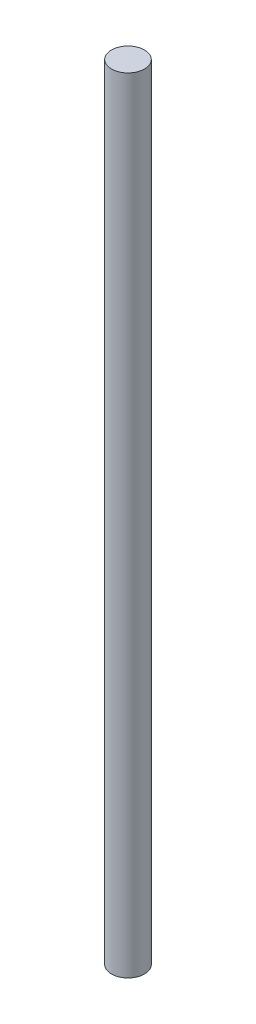
ISO-10303-21;
HEADER;
FILE_DESCRIPTION(('STEP AP214'),'2;1');
FILE_NAME('part.step','',(''),(''),'','','');
FILE_SCHEMA(('AUTOMOTIVE_DESIGN { 1 0 10303 214 1 1 1 1 }'));
ENDSEC;
DATA;
#1=APPLICATION_CONTEXT('core data for automotive mechanical design processes');
#2=APPLICATION_PROTOCOL_DEFINITION('international standard','automotive_design',2000,#1);
#3=PRODUCT_CONTEXT('',#1,'mechanical');
#4=PRODUCT('Part','Part','',(#3));
#5=PRODUCT_RELATED_PRODUCT_CATEGORY('part','',(#4));
#6=PRODUCT_DEFINITION_FORMATION('','',#4);
#7=PRODUCT_DEFINITION_CONTEXT('part definition',#1,'design');
#8=PRODUCT_DEFINITION('design','',#6,#7);
#9=PRODUCT_DEFINITION_SHAPE('','',#8);
#10=(LENGTH_UNIT() NAMED_UNIT(*) SI_UNIT(.MILLI.,.METRE.));
#11=(NAMED_UNIT(*) PLANE_ANGLE_UNIT() SI_UNIT($,.RADIAN.));
#12=(NAMED_UNIT(*) SI_UNIT($,.STERADIAN.) SOLID_ANGLE_UNIT());
#13=UNCERTAINTY_MEASURE_WITH_UNIT(LENGTH_MEASURE(1.E-05),#10,'distance_accuracy_value','');
#14=(GEOMETRIC_REPRESENTATION_CONTEXT(3) GLOBAL_UNCERTAINTY_ASSIGNED_CONTEXT((#13)) GLOBAL_UNIT_ASSIGNED_CONTEXT((#10,
#11,#12)) REPRESENTATION_CONTEXT('',''));
#15=CARTESIAN_POINT('',(0.,0.,0.));
#16=DIRECTION('',(0.,0.,1.));
#17=DIRECTION('',(1.,0.,0.));
#18=AXIS2_PLACEMENT_3D('',#15,#16,#17);
#19=CARTESIAN_POINT('',(0.,-190.,0.));
#20=DIRECTION('',(0.,1.,0.));
#21=DIRECTION('',(0.,0.,1.));
#22=AXIS2_PLACEMENT_3D('',#19,#20,#21);
#23=CYLINDRICAL_SURFACE('',#22,4.);
#24=CARTESIAN_POINT('',(0.,-190.,0.));
#25=DIRECTION('',(0.,1.,0.));
#26=DIRECTION('',(0.,0.,1.));
#27=AXIS2_PLACEMENT_3D('',#24,#25,#26);
#28=CIRCLE('',#27,4.);
#29=CARTESIAN_POINT('',(0.,-190.,4.));
#30=VERTEX_POINT('',#29);
#31=EDGE_CURVE('E10',#30,#30,#28,.T.);
#32=ORIENTED_EDGE('',*,*,#31,.T.);
#33=EDGE_LOOP('',(#32));
#34=FACE_BOUND('',#33,.T.);
#35=CARTESIAN_POINT('',(0.,0.,0.));
#36=DIRECTION('',(0.,1.,0.));
#37=DIRECTION('',(0.,0.,1.));
#38=AXIS2_PLACEMENT_3D('',#35,#36,#37);
#39=CIRCLE('',#38,4.);
#40=CARTESIAN_POINT('',(0.,0.,4.));
#41=VERTEX_POINT('',#40);
#42=EDGE_CURVE('E33',#41,#41,#39,.T.);
#43=ORIENTED_EDGE('',*,*,#42,.F.);
#44=EDGE_LOOP('',(#43));
#45=FACE_BOUND('',#44,.T.);
#46=ADVANCED_FACE('F30',(#34,#45),#23,.T.);
#47=CARTESIAN_POINT('',(0.,-190.,0.));
#48=DIRECTION('',(0.,1.,0.));
#49=DIRECTION('',(0.,0.,1.));
#50=AXIS2_PLACEMENT_3D('',#47,#48,#49);
#51=PLANE('',#50);
#52=ORIENTED_EDGE('',*,*,#31,.F.);
#53=EDGE_LOOP('',(#52));
#54=FACE_BOUND('',#53,.T.);
#55=ADVANCED_FACE('F45',(#54),#51,.F.);
#56=CARTESIAN_POINT('',(0.,0.,0.));
#57=DIRECTION('',(0.,1.,0.));
#58=DIRECTION('',(0.,0.,1.));
#59=AXIS2_PLACEMENT_3D('',#56,#57,#58);
#60=PLANE('',#59);
#61=ORIENTED_EDGE('',*,*,#42,.T.);
#62=EDGE_LOOP('',(#61));
#63=FACE_BOUND('',#62,.T.);
#64=ADVANCED_FACE('F42',(#63),#60,.T.);
#65=CLOSED_SHELL('',(#46,#55,#64));
#66=MANIFOLD_SOLID_BREP('B2',#65);
#67=ADVANCED_BREP_SHAPE_REPRESENTATION('',(#18,#66),#14);
#68=SHAPE_DEFINITION_REPRESENTATION(#9,#67);
ENDSEC;
END-ISO-10303-21;
